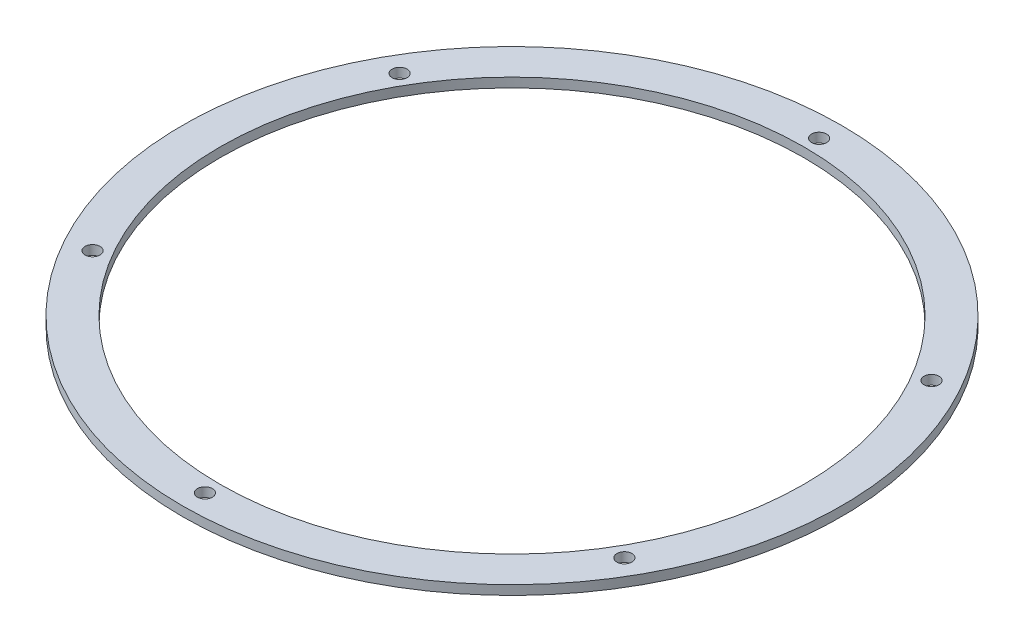
ISO-10303-21;
HEADER;
FILE_DESCRIPTION(('STEP AP214'),'2;1');
FILE_NAME('part.step','',(''),(''),'','','');
FILE_SCHEMA(('AUTOMOTIVE_DESIGN { 1 0 10303 214 1 1 1 1 }'));
ENDSEC;
DATA;
#1=APPLICATION_CONTEXT('core data for automotive mechanical design processes');
#2=APPLICATION_PROTOCOL_DEFINITION('international standard','automotive_design',2000,#1);
#3=PRODUCT_CONTEXT('',#1,'mechanical');
#4=PRODUCT('Part','Part','',(#3));
#5=PRODUCT_RELATED_PRODUCT_CATEGORY('part','',(#4));
#6=PRODUCT_DEFINITION_FORMATION('','',#4);
#7=PRODUCT_DEFINITION_CONTEXT('part definition',#1,'design');
#8=PRODUCT_DEFINITION('design','',#6,#7);
#9=PRODUCT_DEFINITION_SHAPE('','',#8);
#10=(LENGTH_UNIT() NAMED_UNIT(*) SI_UNIT(.MILLI.,.METRE.));
#11=(NAMED_UNIT(*) PLANE_ANGLE_UNIT() SI_UNIT($,.RADIAN.));
#12=(NAMED_UNIT(*) SI_UNIT($,.STERADIAN.) SOLID_ANGLE_UNIT());
#13=UNCERTAINTY_MEASURE_WITH_UNIT(LENGTH_MEASURE(1.E-05),#10,'distance_accuracy_value','');
#14=(GEOMETRIC_REPRESENTATION_CONTEXT(3) GLOBAL_UNCERTAINTY_ASSIGNED_CONTEXT((#13)) GLOBAL_UNIT_ASSIGNED_CONTEXT((#10,
#11,#12)) REPRESENTATION_CONTEXT('',''));
#15=CARTESIAN_POINT('',(0.,0.,0.));
#16=DIRECTION('',(0.,0.,1.));
#17=DIRECTION('',(1.,0.,0.));
#18=AXIS2_PLACEMENT_3D('',#15,#16,#17);
#19=CARTESIAN_POINT('',(0.,2.5,0.));
#20=DIRECTION('',(0.,1.,0.));
#21=DIRECTION('',(0.,0.,1.));
#22=AXIS2_PLACEMENT_3D('',#19,#20,#21);
#23=PLANE('',#22);
#24=CARTESIAN_POINT('',(-71.014083110324,2.5,-40.9999999999999));
#25=DIRECTION('',(0.,1.,0.));
#26=DIRECTION('',(0.,0.,1.));
#27=AXIS2_PLACEMENT_3D('',#24,#25,#26);
#28=CIRCLE('',#27,1.9999999999979);
#29=CARTESIAN_POINT('',(-71.014083110324,2.5,-39.000000000002));
#30=VERTEX_POINT('',#29);
#31=EDGE_CURVE('E74',#30,#30,#28,.T.);
#32=ORIENTED_EDGE('',*,*,#31,.F.);
#33=EDGE_LOOP('',(#32));
#34=FACE_BOUND('',#33,.T.);
#35=CARTESIAN_POINT('',(-1.70946014630855E-12,2.5,82.));
#36=DIRECTION('',(0.,1.,0.));
#37=DIRECTION('',(0.,0.,1.));
#38=AXIS2_PLACEMENT_3D('',#35,#36,#37);
#39=CIRCLE('',#38,2.);
#40=CARTESIAN_POINT('',(-1.70946014630855E-12,2.5,84.));
#41=VERTEX_POINT('',#40);
#42=EDGE_CURVE('E62',#41,#41,#39,.T.);
#43=ORIENTED_EDGE('',*,*,#42,.F.);
#44=EDGE_LOOP('',(#43));
#45=FACE_BOUND('',#44,.T.);
#46=CARTESIAN_POINT('',(71.0140831103246,2.5,-40.9999999999988));
#47=DIRECTION('',(0.,1.,0.));
#48=DIRECTION('',(0.,0.,1.));
#49=AXIS2_PLACEMENT_3D('',#46,#47,#48);
#50=CIRCLE('',#49,1.99999999999999);
#51=CARTESIAN_POINT('',(71.0140831103246,2.5,-38.9999999999989));
#52=VERTEX_POINT('',#51);
#53=EDGE_CURVE('E50',#52,#52,#50,.T.);
#54=ORIENTED_EDGE('',*,*,#53,.F.);
#55=EDGE_LOOP('',(#54));
#56=FACE_BOUND('',#55,.T.);
#57=CARTESIAN_POINT('',(0.,2.5,0.));
#58=DIRECTION('',(0.,1.,0.));
#59=DIRECTION('',(0.,0.,1.));
#60=AXIS2_PLACEMENT_3D('',#57,#58,#59);
#61=CIRCLE('',#60,88.);
#62=CARTESIAN_POINT('',(0.,2.5,88.));
#63=VERTEX_POINT('',#62);
#64=EDGE_CURVE('E10',#63,#63,#61,.T.);
#65=ORIENTED_EDGE('',*,*,#64,.T.);
#66=EDGE_LOOP('',(#65));
#67=FACE_BOUND('',#66,.T.);
#68=CARTESIAN_POINT('',(0.,2.5,-82.));
#69=DIRECTION('',(0.,1.,0.));
#70=DIRECTION('',(0.,0.,1.));
#71=AXIS2_PLACEMENT_3D('',#68,#69,#70);
#72=CIRCLE('',#71,2.00000000000001);
#73=CARTESIAN_POINT('',(0.,2.5,-80.));
#74=VERTEX_POINT('',#73);
#75=EDGE_CURVE('E45',#74,#74,#72,.T.);
#76=ORIENTED_EDGE('',*,*,#75,.F.);
#77=EDGE_LOOP('',(#76));
#78=FACE_BOUND('',#77,.T.);
#79=CARTESIAN_POINT('',(71.0140831103232,2.5,41.0000000000013));
#80=DIRECTION('',(0.,1.,0.));
#81=DIRECTION('',(0.,0.,1.));
#82=AXIS2_PLACEMENT_3D('',#79,#80,#81);
#83=CIRCLE('',#82,2.);
#84=CARTESIAN_POINT('',(71.0140831103232,2.5,43.0000000000013));
#85=VERTEX_POINT('',#84);
#86=EDGE_CURVE('E56',#85,#85,#83,.T.);
#87=ORIENTED_EDGE('',*,*,#86,.F.);
#88=EDGE_LOOP('',(#87));
#89=FACE_BOUND('',#88,.T.);
#90=CARTESIAN_POINT('',(-71.014083110324,2.5,41.));
#91=DIRECTION('',(0.,1.,0.));
#92=DIRECTION('',(0.,0.,1.));
#93=AXIS2_PLACEMENT_3D('',#90,#91,#92);
#94=CIRCLE('',#93,1.99999999999856);
#95=CARTESIAN_POINT('',(-71.014083110324,2.5,42.9999999999986));
#96=VERTEX_POINT('',#95);
#97=EDGE_CURVE('E68',#96,#96,#94,.T.);
#98=ORIENTED_EDGE('',*,*,#97,.F.);
#99=EDGE_LOOP('',(#98));
#100=FACE_BOUND('',#99,.T.);
#101=CARTESIAN_POINT('',(0.,2.5,0.));
#102=DIRECTION('',(0.,1.,0.));
#103=DIRECTION('',(0.,0.,1.));
#104=AXIS2_PLACEMENT_3D('',#101,#102,#103);
#105=CIRCLE('',#104,78.);
#106=CARTESIAN_POINT('',(0.,2.5,78.));
#107=VERTEX_POINT('',#106);
#108=EDGE_CURVE('E80',#107,#107,#105,.T.);
#109=ORIENTED_EDGE('',*,*,#108,.F.);
#110=EDGE_LOOP('',(#109));
#111=FACE_BOUND('',#110,.T.);
#112=ADVANCED_FACE('F34',(#34,#45,#56,#67,#78,#89,#100,#111),#23,.T.);
#113=CARTESIAN_POINT('',(0.,0.,0.));
#114=DIRECTION('',(0.,1.,0.));
#115=DIRECTION('',(0.,0.,1.));
#116=AXIS2_PLACEMENT_3D('',#113,#114,#115);
#117=PLANE('',#116);
#118=CARTESIAN_POINT('',(0.,0.,0.));
#119=DIRECTION('',(0.,1.,0.));
#120=DIRECTION('',(0.,0.,1.));
#121=AXIS2_PLACEMENT_3D('',#118,#119,#120);
#122=CIRCLE('',#121,88.);
#123=CARTESIAN_POINT('',(0.,0.,88.));
#124=VERTEX_POINT('',#123);
#125=EDGE_CURVE('E38',#124,#124,#122,.T.);
#126=ORIENTED_EDGE('',*,*,#125,.F.);
#127=EDGE_LOOP('',(#126));
#128=FACE_BOUND('',#127,.T.);
#129=CARTESIAN_POINT('',(0.,0.,-82.));
#130=DIRECTION('',(0.,1.,0.));
#131=DIRECTION('',(0.,0.,1.));
#132=AXIS2_PLACEMENT_3D('',#129,#130,#131);
#133=CIRCLE('',#132,2.00000000000001);
#134=CARTESIAN_POINT('',(0.,0.,-80.));
#135=VERTEX_POINT('',#134);
#136=EDGE_CURVE('E47',#135,#135,#133,.T.);
#137=ORIENTED_EDGE('',*,*,#136,.T.);
#138=EDGE_LOOP('',(#137));
#139=FACE_BOUND('',#138,.T.);
#140=CARTESIAN_POINT('',(71.0140831103246,0.,-40.9999999999988));
#141=DIRECTION('',(0.,1.,0.));
#142=DIRECTION('',(0.,0.,1.));
#143=AXIS2_PLACEMENT_3D('',#140,#141,#142);
#144=CIRCLE('',#143,1.99999999999999);
#145=CARTESIAN_POINT('',(71.0140831103246,0.,-38.9999999999989));
#146=VERTEX_POINT('',#145);
#147=EDGE_CURVE('E53',#146,#146,#144,.T.);
#148=ORIENTED_EDGE('',*,*,#147,.T.);
#149=EDGE_LOOP('',(#148));
#150=FACE_BOUND('',#149,.T.);
#151=CARTESIAN_POINT('',(71.0140831103232,0.,41.0000000000013));
#152=DIRECTION('',(0.,1.,0.));
#153=DIRECTION('',(0.,0.,1.));
#154=AXIS2_PLACEMENT_3D('',#151,#152,#153);
#155=CIRCLE('',#154,2.);
#156=CARTESIAN_POINT('',(71.0140831103232,0.,43.0000000000013));
#157=VERTEX_POINT('',#156);
#158=EDGE_CURVE('E59',#157,#157,#155,.T.);
#159=ORIENTED_EDGE('',*,*,#158,.T.);
#160=EDGE_LOOP('',(#159));
#161=FACE_BOUND('',#160,.T.);
#162=CARTESIAN_POINT('',(-1.70946014630855E-12,0.,82.));
#163=DIRECTION('',(0.,1.,0.));
#164=DIRECTION('',(0.,0.,1.));
#165=AXIS2_PLACEMENT_3D('',#162,#163,#164);
#166=CIRCLE('',#165,2.);
#167=CARTESIAN_POINT('',(-1.70946014630855E-12,0.,84.));
#168=VERTEX_POINT('',#167);
#169=EDGE_CURVE('E65',#168,#168,#166,.T.);
#170=ORIENTED_EDGE('',*,*,#169,.T.);
#171=EDGE_LOOP('',(#170));
#172=FACE_BOUND('',#171,.T.);
#173=CARTESIAN_POINT('',(-71.014083110324,0.,41.));
#174=DIRECTION('',(0.,1.,0.));
#175=DIRECTION('',(0.,0.,1.));
#176=AXIS2_PLACEMENT_3D('',#173,#174,#175);
#177=CIRCLE('',#176,1.99999999999856);
#178=CARTESIAN_POINT('',(-71.014083110324,0.,42.9999999999986));
#179=VERTEX_POINT('',#178);
#180=EDGE_CURVE('E71',#179,#179,#177,.T.);
#181=ORIENTED_EDGE('',*,*,#180,.T.);
#182=EDGE_LOOP('',(#181));
#183=FACE_BOUND('',#182,.T.);
#184=CARTESIAN_POINT('',(-71.014083110324,0.,-40.9999999999999));
#185=DIRECTION('',(0.,1.,0.));
#186=DIRECTION('',(0.,0.,1.));
#187=AXIS2_PLACEMENT_3D('',#184,#185,#186);
#188=CIRCLE('',#187,1.9999999999979);
#189=CARTESIAN_POINT('',(-71.014083110324,0.,-39.000000000002));
#190=VERTEX_POINT('',#189);
#191=EDGE_CURVE('E77',#190,#190,#188,.T.);
#192=ORIENTED_EDGE('',*,*,#191,.T.);
#193=EDGE_LOOP('',(#192));
#194=FACE_BOUND('',#193,.T.);
#195=CARTESIAN_POINT('',(0.,0.,0.));
#196=DIRECTION('',(0.,1.,0.));
#197=DIRECTION('',(0.,0.,1.));
#198=AXIS2_PLACEMENT_3D('',#195,#196,#197);
#199=CIRCLE('',#198,78.);
#200=CARTESIAN_POINT('',(0.,0.,78.));
#201=VERTEX_POINT('',#200);
#202=EDGE_CURVE('E83',#201,#201,#199,.T.);
#203=ORIENTED_EDGE('',*,*,#202,.T.);
#204=EDGE_LOOP('',(#203));
#205=FACE_BOUND('',#204,.T.);
#206=ADVANCED_FACE('F93',(#128,#139,#150,#161,#172,#183,#194,#205),#117,.F.);
#207=CARTESIAN_POINT('',(0.,2.5,0.));
#208=DIRECTION('',(0.,-1.,0.));
#209=DIRECTION('',(0.,0.,-1.));
#210=AXIS2_PLACEMENT_3D('',#207,#208,#209);
#211=CYLINDRICAL_SURFACE('',#210,88.);
#212=ORIENTED_EDGE('',*,*,#64,.F.);
#213=EDGE_LOOP('',(#212));
#214=FACE_BOUND('',#213,.T.);
#215=ORIENTED_EDGE('',*,*,#125,.T.);
#216=EDGE_LOOP('',(#215));
#217=FACE_BOUND('',#216,.T.);
#218=ADVANCED_FACE('F36',(#214,#217),#211,.T.);
#219=CARTESIAN_POINT('',(0.,2.5,-82.));
#220=DIRECTION('',(0.,-1.,0.));
#221=DIRECTION('',(0.,0.,-1.));
#222=AXIS2_PLACEMENT_3D('',#219,#220,#221);
#223=CYLINDRICAL_SURFACE('',#222,2.00000000000001);
#224=ORIENTED_EDGE('',*,*,#75,.T.);
#225=EDGE_LOOP('',(#224));
#226=FACE_BOUND('',#225,.T.);
#227=ORIENTED_EDGE('',*,*,#136,.F.);
#228=EDGE_LOOP('',(#227));
#229=FACE_BOUND('',#228,.T.);
#230=ADVANCED_FACE('F103',(#226,#229),#223,.F.);
#231=CARTESIAN_POINT('',(71.0140831103246,2.5,-40.9999999999988));
#232=DIRECTION('',(0.,-1.,0.));
#233=DIRECTION('',(0.,0.,-1.));
#234=AXIS2_PLACEMENT_3D('',#231,#232,#233);
#235=CYLINDRICAL_SURFACE('',#234,1.99999999999999);
#236=ORIENTED_EDGE('',*,*,#53,.T.);
#237=EDGE_LOOP('',(#236));
#238=FACE_BOUND('',#237,.T.);
#239=ORIENTED_EDGE('',*,*,#147,.F.);
#240=EDGE_LOOP('',(#239));
#241=FACE_BOUND('',#240,.T.);
#242=ADVANCED_FACE('F106',(#238,#241),#235,.F.);
#243=CARTESIAN_POINT('',(71.0140831103232,2.5,41.0000000000013));
#244=DIRECTION('',(0.,-1.,0.));
#245=DIRECTION('',(0.,0.,-1.));
#246=AXIS2_PLACEMENT_3D('',#243,#244,#245);
#247=CYLINDRICAL_SURFACE('',#246,2.);
#248=ORIENTED_EDGE('',*,*,#86,.T.);
#249=EDGE_LOOP('',(#248));
#250=FACE_BOUND('',#249,.T.);
#251=ORIENTED_EDGE('',*,*,#158,.F.);
#252=EDGE_LOOP('',(#251));
#253=FACE_BOUND('',#252,.T.);
#254=ADVANCED_FACE('F110',(#250,#253),#247,.F.);
#255=CARTESIAN_POINT('',(-1.70946014630855E-12,2.5,82.));
#256=DIRECTION('',(0.,-1.,0.));
#257=DIRECTION('',(0.,0.,-1.));
#258=AXIS2_PLACEMENT_3D('',#255,#256,#257);
#259=CYLINDRICAL_SURFACE('',#258,2.);
#260=ORIENTED_EDGE('',*,*,#42,.T.);
#261=EDGE_LOOP('',(#260));
#262=FACE_BOUND('',#261,.T.);
#263=ORIENTED_EDGE('',*,*,#169,.F.);
#264=EDGE_LOOP('',(#263));
#265=FACE_BOUND('',#264,.T.);
#266=ADVANCED_FACE('F114',(#262,#265),#259,.F.);
#267=CARTESIAN_POINT('',(-71.014083110324,2.5,41.));
#268=DIRECTION('',(0.,-1.,0.));
#269=DIRECTION('',(0.,0.,-1.));
#270=AXIS2_PLACEMENT_3D('',#267,#268,#269);
#271=CYLINDRICAL_SURFACE('',#270,1.99999999999856);
#272=ORIENTED_EDGE('',*,*,#97,.T.);
#273=EDGE_LOOP('',(#272));
#274=FACE_BOUND('',#273,.T.);
#275=ORIENTED_EDGE('',*,*,#180,.F.);
#276=EDGE_LOOP('',(#275));
#277=FACE_BOUND('',#276,.T.);
#278=ADVANCED_FACE('F118',(#274,#277),#271,.F.);
#279=CARTESIAN_POINT('',(-71.014083110324,2.5,-40.9999999999999));
#280=DIRECTION('',(0.,-1.,0.));
#281=DIRECTION('',(0.,0.,-1.));
#282=AXIS2_PLACEMENT_3D('',#279,#280,#281);
#283=CYLINDRICAL_SURFACE('',#282,1.9999999999979);
#284=ORIENTED_EDGE('',*,*,#31,.T.);
#285=EDGE_LOOP('',(#284));
#286=FACE_BOUND('',#285,.T.);
#287=ORIENTED_EDGE('',*,*,#191,.F.);
#288=EDGE_LOOP('',(#287));
#289=FACE_BOUND('',#288,.T.);
#290=ADVANCED_FACE('F122',(#286,#289),#283,.F.);
#291=CARTESIAN_POINT('',(0.,2.5,0.));
#292=DIRECTION('',(0.,-1.,0.));
#293=DIRECTION('',(0.,0.,-1.));
#294=AXIS2_PLACEMENT_3D('',#291,#292,#293);
#295=CYLINDRICAL_SURFACE('',#294,78.);
#296=ORIENTED_EDGE('',*,*,#108,.T.);
#297=EDGE_LOOP('',(#296));
#298=FACE_BOUND('',#297,.T.);
#299=ORIENTED_EDGE('',*,*,#202,.F.);
#300=EDGE_LOOP('',(#299));
#301=FACE_BOUND('',#300,.T.);
#302=ADVANCED_FACE('F89',(#298,#301),#295,.F.);
#303=CLOSED_SHELL('',(#112,#206,#218,#230,#242,#254,#266,#278,#290,#302));
#304=MANIFOLD_SOLID_BREP('B2',#303);
#305=ADVANCED_BREP_SHAPE_REPRESENTATION('',(#18,#304),#14);
#306=SHAPE_DEFINITION_REPRESENTATION(#9,#305);
ENDSEC;
END-ISO-10303-21;
